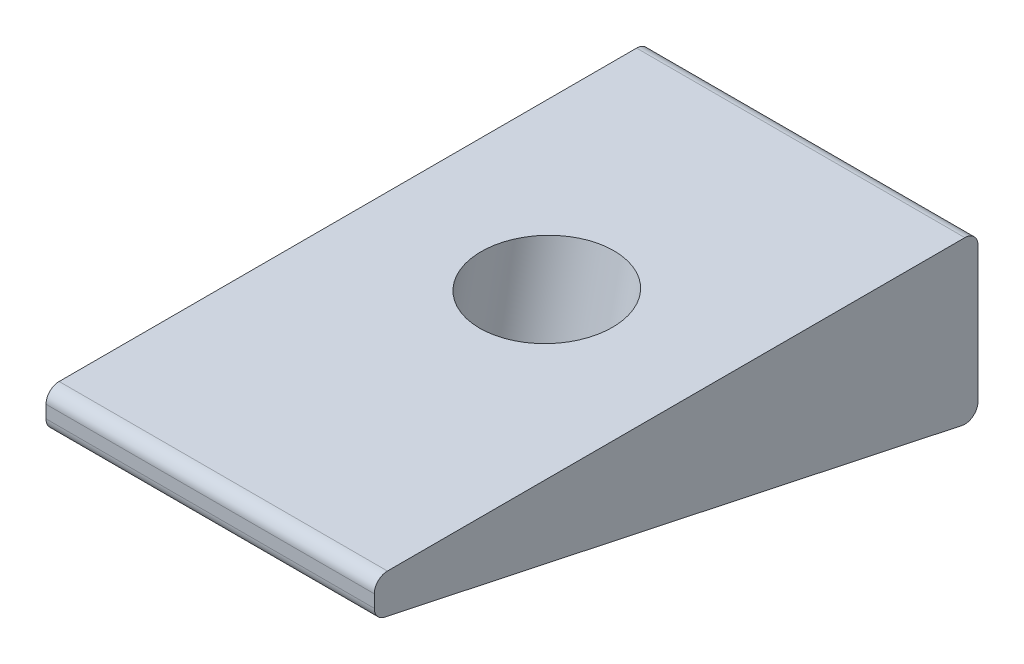
ISO-10303-21;
HEADER;
FILE_DESCRIPTION(('STEP AP214'),'2;1');
FILE_NAME('part.step','',(''),(''),'','','');
FILE_SCHEMA(('AUTOMOTIVE_DESIGN { 1 0 10303 214 1 1 1 1 }'));
ENDSEC;
DATA;
#1=APPLICATION_CONTEXT('core data for automotive mechanical design processes');
#2=APPLICATION_PROTOCOL_DEFINITION('international standard','automotive_design',2000,#1);
#3=PRODUCT_CONTEXT('',#1,'mechanical');
#4=PRODUCT('Part','Part','',(#3));
#5=PRODUCT_RELATED_PRODUCT_CATEGORY('part','',(#4));
#6=PRODUCT_DEFINITION_FORMATION('','',#4);
#7=PRODUCT_DEFINITION_CONTEXT('part definition',#1,'design');
#8=PRODUCT_DEFINITION('design','',#6,#7);
#9=PRODUCT_DEFINITION_SHAPE('','',#8);
#10=(LENGTH_UNIT() NAMED_UNIT(*) SI_UNIT(.MILLI.,.METRE.));
#11=(NAMED_UNIT(*) PLANE_ANGLE_UNIT() SI_UNIT($,.RADIAN.));
#12=(NAMED_UNIT(*) SI_UNIT($,.STERADIAN.) SOLID_ANGLE_UNIT());
#13=UNCERTAINTY_MEASURE_WITH_UNIT(LENGTH_MEASURE(1.E-05),#10,'distance_accuracy_value','');
#14=(GEOMETRIC_REPRESENTATION_CONTEXT(3) GLOBAL_UNCERTAINTY_ASSIGNED_CONTEXT((#13)) GLOBAL_UNIT_ASSIGNED_CONTEXT((#10,
#11,#12)) REPRESENTATION_CONTEXT('',''));
#15=CARTESIAN_POINT('',(0.,0.,0.));
#16=DIRECTION('',(0.,0.,1.));
#17=DIRECTION('',(1.,0.,0.));
#18=AXIS2_PLACEMENT_3D('',#15,#16,#17);
#19=CARTESIAN_POINT('',(25.,-25.,0.));
#20=DIRECTION('',(0.,0.,1.));
#21=DIRECTION('',(1.,0.,0.));
#22=AXIS2_PLACEMENT_3D('',#19,#20,#21);
#23=PLANE('',#22);
#24=DIRECTION('',(0.,1.,0.));
#25=VECTOR('',#24,1.);
#26=CARTESIAN_POINT('',(25.,-25.,0.));
#27=LINE('',#26,#25);
#28=CARTESIAN_POINT('',(25.,-23.765102843465,0.));
#29=VERTEX_POINT('',#28);
#30=CARTESIAN_POINT('',(25.,-13.4580507922195,0.));
#31=VERTEX_POINT('',#30);
#32=EDGE_CURVE('E138',#29,#31,#27,.T.);
#33=ORIENTED_EDGE('',*,*,#32,.F.);
#34=DIRECTION('',(-1.,0.,0.));
#35=VECTOR('',#34,1.);
#36=CARTESIAN_POINT('',(25.,-23.765102843465,0.));
#37=LINE('',#36,#35);
#38=CARTESIAN_POINT('',(0.,-23.765102843465,0.));
#39=VERTEX_POINT('',#38);
#40=EDGE_CURVE('E182',#29,#39,#37,.T.);
#41=ORIENTED_EDGE('',*,*,#40,.T.);
#42=DIRECTION('',(0.,1.,0.));
#43=VECTOR('',#42,1.);
#44=CARTESIAN_POINT('',(0.,-25.,0.));
#45=LINE('',#44,#43);
#46=CARTESIAN_POINT('',(0.,-13.4580507922195,0.));
#47=VERTEX_POINT('',#46);
#48=EDGE_CURVE('E145',#39,#47,#45,.T.);
#49=ORIENTED_EDGE('',*,*,#48,.T.);
#50=DIRECTION('',(-1.,0.,0.));
#51=VECTOR('',#50,1.);
#52=CARTESIAN_POINT('',(25.,-13.4580507922195,0.));
#53=LINE('',#52,#51);
#54=EDGE_CURVE('E59',#47,#31,#53,.F.);
#55=ORIENTED_EDGE('',*,*,#54,.T.);
#56=EDGE_LOOP('',(#33,#41,#49,#55));
#57=FACE_BOUND('',#56,.T.);
#58=ADVANCED_FACE('F43',(#57),#23,.F.);
#59=CARTESIAN_POINT('',(25.,-15.2281505315655,45.9729372344889));
#60=DIRECTION('',(0.,0.,-1.));
#61=DIRECTION('',(-1.,0.,0.));
#62=AXIS2_PLACEMENT_3D('',#59,#60,#61);
#63=PLANE('',#62);
#64=DIRECTION('',(0.,-1.,0.));
#65=VECTOR('',#64,1.);
#66=CARTESIAN_POINT('',(0.,-15.2281505315655,45.9729372344889));
#67=LINE('',#66,#65);
#68=CARTESIAN_POINT('',(0.,-13.4580507922195,45.9729372344889));
#69=VERTEX_POINT('',#68);
#70=CARTESIAN_POINT('',(0.,-14.4183664983705,45.9729372344889));
#71=VERTEX_POINT('',#70);
#72=EDGE_CURVE('E139',#69,#71,#67,.T.);
#73=ORIENTED_EDGE('',*,*,#72,.T.);
#74=DIRECTION('',(-1.,0.,0.));
#75=VECTOR('',#74,1.);
#76=CARTESIAN_POINT('',(25.,-14.4183664983705,45.9729372344889));
#77=LINE('',#76,#75);
#78=CARTESIAN_POINT('',(25.,-14.4183664983705,45.9729372344889));
#79=VERTEX_POINT('',#78);
#80=EDGE_CURVE('E115',#71,#79,#77,.F.);
#81=ORIENTED_EDGE('',*,*,#80,.T.);
#82=DIRECTION('',(0.,-1.,0.));
#83=VECTOR('',#82,1.);
#84=CARTESIAN_POINT('',(25.,-15.2281505315655,45.9729372344889));
#85=LINE('',#84,#83);
#86=CARTESIAN_POINT('',(25.,-13.4580507922195,45.9729372344889));
#87=VERTEX_POINT('',#86);
#88=EDGE_CURVE('E143',#87,#79,#85,.T.);
#89=ORIENTED_EDGE('',*,*,#88,.F.);
#90=DIRECTION('',(-1.,0.,0.));
#91=VECTOR('',#90,1.);
#92=CARTESIAN_POINT('',(25.,-13.4580507922195,45.9729372344889));
#93=LINE('',#92,#91);
#94=EDGE_CURVE('E121',#87,#69,#93,.T.);
#95=ORIENTED_EDGE('',*,*,#94,.T.);
#96=EDGE_LOOP('',(#73,#81,#89,#95));
#97=FACE_BOUND('',#96,.T.);
#98=ADVANCED_FACE('F220',(#97),#63,.F.);
#99=CARTESIAN_POINT('',(25.,-25.,0.));
#100=DIRECTION('',(0.,0.978147600733806,-0.207911690817756));
#101=DIRECTION('',(0.,0.207911690817756,0.978147600733806));
#102=AXIS2_PLACEMENT_3D('',#99,#100,#101);
#103=PLANE('',#102);
#104=CARTESIAN_POINT('',(12.5,-20.3219869566005,22.0083210165106));
#105=DIRECTION('',(0.,-0.978147600733806,0.207911690817756));
#106=DIRECTION('',(0.,-0.207911690817756,-0.978147600733806));
#107=AXIS2_PLACEMENT_3D('',#104,#105,#106);
#108=CIRCLE('',#107,5.);
#109=CARTESIAN_POINT('',(12.5,-21.3615454106893,17.1175830128416));
#110=VERTEX_POINT('',#109);
#111=EDGE_CURVE('E153',#110,#110,#108,.T.);
#112=ORIENTED_EDGE('',*,*,#111,.F.);
#113=EDGE_LOOP('',(#112));
#114=FACE_BOUND('',#113,.T.);
#115=DIRECTION('',(0.,-0.207911690817756,-0.978147600733806));
#116=VECTOR('',#115,1.);
#117=CARTESIAN_POINT('',(25.,-25.,0.));
#118=LINE('',#117,#116);
#119=CARTESIAN_POINT('',(25.,-15.3965140991043,45.1808489253066));
#120=VERTEX_POINT('',#119);
#121=CARTESIAN_POINT('',(25.,-24.7432504441988,1.20791169081776));
#122=VERTEX_POINT('',#121);
#123=EDGE_CURVE('E130',#120,#122,#118,.T.);
#124=ORIENTED_EDGE('',*,*,#123,.F.);
#125=DIRECTION('',(-1.,0.,0.));
#126=VECTOR('',#125,1.);
#127=CARTESIAN_POINT('',(25.,-15.3965140991043,45.1808489253066));
#128=LINE('',#127,#126);
#129=CARTESIAN_POINT('',(0.,-15.3965140991043,45.1808489253066));
#130=VERTEX_POINT('',#129);
#131=EDGE_CURVE('E114',#120,#130,#128,.T.);
#132=ORIENTED_EDGE('',*,*,#131,.T.);
#133=DIRECTION('',(0.,-0.207911690817756,-0.978147600733806));
#134=VECTOR('',#133,1.);
#135=CARTESIAN_POINT('',(0.,-25.,0.));
#136=LINE('',#135,#134);
#137=CARTESIAN_POINT('',(0.,-24.7432504441988,1.20791169081776));
#138=VERTEX_POINT('',#137);
#139=EDGE_CURVE('E128',#130,#138,#136,.T.);
#140=ORIENTED_EDGE('',*,*,#139,.T.);
#141=DIRECTION('',(-1.,0.,0.));
#142=VECTOR('',#141,1.);
#143=CARTESIAN_POINT('',(25.,-24.7432504441988,1.20791169081776));
#144=LINE('',#143,#142);
#145=EDGE_CURVE('E133',#138,#122,#144,.F.);
#146=ORIENTED_EDGE('',*,*,#145,.T.);
#147=EDGE_LOOP('',(#124,#132,#140,#146));
#148=FACE_BOUND('',#147,.T.);
#149=ADVANCED_FACE('F127',(#114,#148),#103,.F.);
#150=CARTESIAN_POINT('',(25.,0.,0.));
#151=DIRECTION('',(1.,0.,0.));
#152=DIRECTION('',(0.,0.,-1.));
#153=AXIS2_PLACEMENT_3D('',#150,#151,#152);
#154=PLANE('',#153);
#155=ORIENTED_EDGE('',*,*,#88,.T.);
#156=CARTESIAN_POINT('',(25.,-14.4183664983705,44.9729372344889));
#157=DIRECTION('',(1.,0.,0.));
#158=DIRECTION('',(0.,0.,-1.));
#159=AXIS2_PLACEMENT_3D('',#156,#157,#158);
#160=CIRCLE('',#159,1.);
#161=EDGE_CURVE('E177',#79,#120,#160,.T.);
#162=ORIENTED_EDGE('',*,*,#161,.T.);
#163=ORIENTED_EDGE('',*,*,#123,.T.);
#164=CARTESIAN_POINT('',(25.,-23.765102843465,1.));
#165=DIRECTION('',(1.,0.,0.));
#166=DIRECTION('',(0.,0.,-1.));
#167=AXIS2_PLACEMENT_3D('',#164,#165,#166);
#168=CIRCLE('',#167,1.);
#169=EDGE_CURVE('E66',#122,#29,#168,.T.);
#170=ORIENTED_EDGE('',*,*,#169,.T.);
#171=ORIENTED_EDGE('',*,*,#32,.T.);
#172=CARTESIAN_POINT('',(25.,-13.4580507922195,1.));
#173=DIRECTION('',(1.,0.,0.));
#174=DIRECTION('',(0.,0.,-1.));
#175=AXIS2_PLACEMENT_3D('',#172,#173,#174);
#176=CIRCLE('',#175,1.);
#177=CARTESIAN_POINT('',(25.,-12.4580507922195,1.));
#178=VERTEX_POINT('',#177);
#179=EDGE_CURVE('E169',#31,#178,#176,.T.);
#180=ORIENTED_EDGE('',*,*,#179,.T.);
#181=DIRECTION('',(0.,0.,1.));
#182=VECTOR('',#181,1.);
#183=CARTESIAN_POINT('',(25.,-12.4580507922195,0.));
#184=LINE('',#183,#182);
#185=CARTESIAN_POINT('',(25.,-12.4580507922195,44.9729372344889));
#186=VERTEX_POINT('',#185);
#187=EDGE_CURVE('E154',#178,#186,#184,.T.);
#188=ORIENTED_EDGE('',*,*,#187,.T.);
#189=CARTESIAN_POINT('',(25.,-13.4580507922195,44.9729372344889));
#190=DIRECTION('',(1.,0.,0.));
#191=DIRECTION('',(0.,0.,-1.));
#192=AXIS2_PLACEMENT_3D('',#189,#190,#191);
#193=CIRCLE('',#192,1.);
#194=EDGE_CURVE('E172',#186,#87,#193,.T.);
#195=ORIENTED_EDGE('',*,*,#194,.T.);
#196=EDGE_LOOP('',(#155,#162,#163,#170,#171,#180,#188,#195));
#197=FACE_BOUND('',#196,.T.);
#198=ADVANCED_FACE('F213',(#197),#154,.T.);
#199=CARTESIAN_POINT('',(0.,0.,0.));
#200=DIRECTION('',(1.,0.,0.));
#201=DIRECTION('',(0.,0.,-1.));
#202=AXIS2_PLACEMENT_3D('',#199,#200,#201);
#203=PLANE('',#202);
#204=ORIENTED_EDGE('',*,*,#139,.F.);
#205=CARTESIAN_POINT('',(0.,-14.4183664983705,44.9729372344889));
#206=DIRECTION('',(1.,0.,0.));
#207=DIRECTION('',(0.,0.,-1.));
#208=AXIS2_PLACEMENT_3D('',#205,#206,#207);
#209=CIRCLE('',#208,1.);
#210=EDGE_CURVE('E110',#130,#71,#209,.F.);
#211=ORIENTED_EDGE('',*,*,#210,.T.);
#212=ORIENTED_EDGE('',*,*,#72,.F.);
#213=CARTESIAN_POINT('',(0.,-13.4580507922195,44.9729372344889));
#214=DIRECTION('',(1.,0.,0.));
#215=DIRECTION('',(0.,0.,-1.));
#216=AXIS2_PLACEMENT_3D('',#213,#214,#215);
#217=CIRCLE('',#216,1.);
#218=CARTESIAN_POINT('',(0.,-12.4580507922195,44.9729372344889));
#219=VERTEX_POINT('',#218);
#220=EDGE_CURVE('E159',#69,#219,#217,.F.);
#221=ORIENTED_EDGE('',*,*,#220,.T.);
#222=DIRECTION('',(0.,0.,1.));
#223=VECTOR('',#222,1.);
#224=CARTESIAN_POINT('',(0.,-12.4580507922195,0.));
#225=LINE('',#224,#223);
#226=CARTESIAN_POINT('',(0.,-12.4580507922195,1.));
#227=VERTEX_POINT('',#226);
#228=EDGE_CURVE('E194',#227,#219,#225,.T.);
#229=ORIENTED_EDGE('',*,*,#228,.F.);
#230=CARTESIAN_POINT('',(0.,-13.4580507922195,1.));
#231=DIRECTION('',(1.,0.,0.));
#232=DIRECTION('',(0.,0.,-1.));
#233=AXIS2_PLACEMENT_3D('',#230,#231,#232);
#234=CIRCLE('',#233,1.);
#235=EDGE_CURVE('E132',#227,#47,#234,.F.);
#236=ORIENTED_EDGE('',*,*,#235,.T.);
#237=ORIENTED_EDGE('',*,*,#48,.F.);
#238=CARTESIAN_POINT('',(0.,-23.765102843465,1.));
#239=DIRECTION('',(1.,0.,0.));
#240=DIRECTION('',(0.,0.,-1.));
#241=AXIS2_PLACEMENT_3D('',#238,#239,#240);
#242=CIRCLE('',#241,1.);
#243=EDGE_CURVE('E122',#39,#138,#242,.F.);
#244=ORIENTED_EDGE('',*,*,#243,.T.);
#245=EDGE_LOOP('',(#204,#211,#212,#221,#229,#236,#237,#244));
#246=FACE_BOUND('',#245,.T.);
#247=ADVANCED_FACE('F135',(#246),#203,.F.);
#248=CARTESIAN_POINT('',(12.5,4.13170306174467,16.8105287460667));
#249=DIRECTION('',(0.,-0.978147600733806,0.207911690817756));
#250=DIRECTION('',(0.,-0.207911690817756,-0.978147600733806));
#251=AXIS2_PLACEMENT_3D('',#248,#249,#250);
#252=CYLINDRICAL_SURFACE('',#251,5.);
#253=CARTESIAN_POINT('',(12.5,-12.4580507922195,20.3367897842173));
#254=DIRECTION('',(0.,-1.,0.));
#255=DIRECTION('',(0.,0.,1.));
#256=AXIS2_PLACEMENT_3D('',#253,#254,#255);
#257=ELLIPSE('',#256,5.11170297432514,5.);
#258=CARTESIAN_POINT('',(12.5,-12.4580507922195,25.4484927585424));
#259=VERTEX_POINT('',#258);
#260=EDGE_CURVE('E149',#259,#259,#257,.F.);
#261=ORIENTED_EDGE('',*,*,#260,.T.);
#262=EDGE_LOOP('',(#261));
#263=FACE_BOUND('',#262,.T.);
#264=ORIENTED_EDGE('',*,*,#111,.T.);
#265=EDGE_LOOP('',(#264));
#266=FACE_BOUND('',#265,.T.);
#267=ADVANCED_FACE('F241',(#263,#266),#252,.F.);
#268=CARTESIAN_POINT('',(25.,-12.4580507922195,0.));
#269=DIRECTION('',(0.,-1.,0.));
#270=DIRECTION('',(0.,0.,-1.));
#271=AXIS2_PLACEMENT_3D('',#268,#269,#270);
#272=PLANE('',#271);
#273=ORIENTED_EDGE('',*,*,#228,.T.);
#274=DIRECTION('',(-1.,0.,0.));
#275=VECTOR('',#274,1.);
#276=CARTESIAN_POINT('',(25.,-12.4580507922195,44.9729372344889));
#277=LINE('',#276,#275);
#278=EDGE_CURVE('E11',#219,#186,#277,.F.);
#279=ORIENTED_EDGE('',*,*,#278,.T.);
#280=ORIENTED_EDGE('',*,*,#187,.F.);
#281=DIRECTION('',(-1.,0.,0.));
#282=VECTOR('',#281,1.);
#283=CARTESIAN_POINT('',(25.,-12.4580507922195,1.));
#284=LINE('',#283,#282);
#285=EDGE_CURVE('E52',#178,#227,#284,.T.);
#286=ORIENTED_EDGE('',*,*,#285,.T.);
#287=EDGE_LOOP('',(#273,#279,#280,#286));
#288=FACE_BOUND('',#287,.T.);
#289=ORIENTED_EDGE('',*,*,#260,.F.);
#290=EDGE_LOOP('',(#289));
#291=FACE_BOUND('',#290,.T.);
#292=ADVANCED_FACE('F192',(#288,#291),#272,.F.);
#293=CARTESIAN_POINT('',(25.,-14.4183664983705,44.9729372344889));
#294=DIRECTION('',(-1.,0.,0.));
#295=DIRECTION('',(0.,0.,1.));
#296=AXIS2_PLACEMENT_3D('',#293,#294,#295);
#297=CYLINDRICAL_SURFACE('',#296,1.);
#298=ORIENTED_EDGE('',*,*,#161,.F.);
#299=ORIENTED_EDGE('',*,*,#80,.F.);
#300=ORIENTED_EDGE('',*,*,#210,.F.);
#301=ORIENTED_EDGE('',*,*,#131,.F.);
#302=EDGE_LOOP('',(#298,#299,#300,#301));
#303=FACE_BOUND('',#302,.T.);
#304=ADVANCED_FACE('F113',(#303),#297,.T.);
#305=CARTESIAN_POINT('',(25.,-23.765102843465,1.));
#306=DIRECTION('',(-1.,0.,0.));
#307=DIRECTION('',(0.,0.,1.));
#308=AXIS2_PLACEMENT_3D('',#305,#306,#307);
#309=CYLINDRICAL_SURFACE('',#308,1.);
#310=ORIENTED_EDGE('',*,*,#169,.F.);
#311=ORIENTED_EDGE('',*,*,#145,.F.);
#312=ORIENTED_EDGE('',*,*,#243,.F.);
#313=ORIENTED_EDGE('',*,*,#40,.F.);
#314=EDGE_LOOP('',(#310,#311,#312,#313));
#315=FACE_BOUND('',#314,.T.);
#316=ADVANCED_FACE('F216',(#315),#309,.T.);
#317=CARTESIAN_POINT('',(25.,-13.4580507922195,44.9729372344889));
#318=DIRECTION('',(-1.,0.,0.));
#319=DIRECTION('',(0.,0.,1.));
#320=AXIS2_PLACEMENT_3D('',#317,#318,#319);
#321=CYLINDRICAL_SURFACE('',#320,1.);
#322=ORIENTED_EDGE('',*,*,#194,.F.);
#323=ORIENTED_EDGE('',*,*,#278,.F.);
#324=ORIENTED_EDGE('',*,*,#220,.F.);
#325=ORIENTED_EDGE('',*,*,#94,.F.);
#326=EDGE_LOOP('',(#322,#323,#324,#325));
#327=FACE_BOUND('',#326,.T.);
#328=ADVANCED_FACE('F222',(#327),#321,.T.);
#329=CARTESIAN_POINT('',(25.,-13.4580507922195,1.));
#330=DIRECTION('',(-1.,0.,0.));
#331=DIRECTION('',(0.,0.,1.));
#332=AXIS2_PLACEMENT_3D('',#329,#330,#331);
#333=CYLINDRICAL_SURFACE('',#332,1.);
#334=ORIENTED_EDGE('',*,*,#179,.F.);
#335=ORIENTED_EDGE('',*,*,#54,.F.);
#336=ORIENTED_EDGE('',*,*,#235,.F.);
#337=ORIENTED_EDGE('',*,*,#285,.F.);
#338=EDGE_LOOP('',(#334,#335,#336,#337));
#339=FACE_BOUND('',#338,.T.);
#340=ADVANCED_FACE('F45',(#339),#333,.T.);
#341=CLOSED_SHELL('',(#58,#98,#149,#198,#247,#267,#292,#304,#316,#328,#340));
#342=MANIFOLD_SOLID_BREP('B2',#341);
#343=ADVANCED_BREP_SHAPE_REPRESENTATION('',(#18,#342),#14);
#344=SHAPE_DEFINITION_REPRESENTATION(#9,#343);
ENDSEC;
END-ISO-10303-21;
